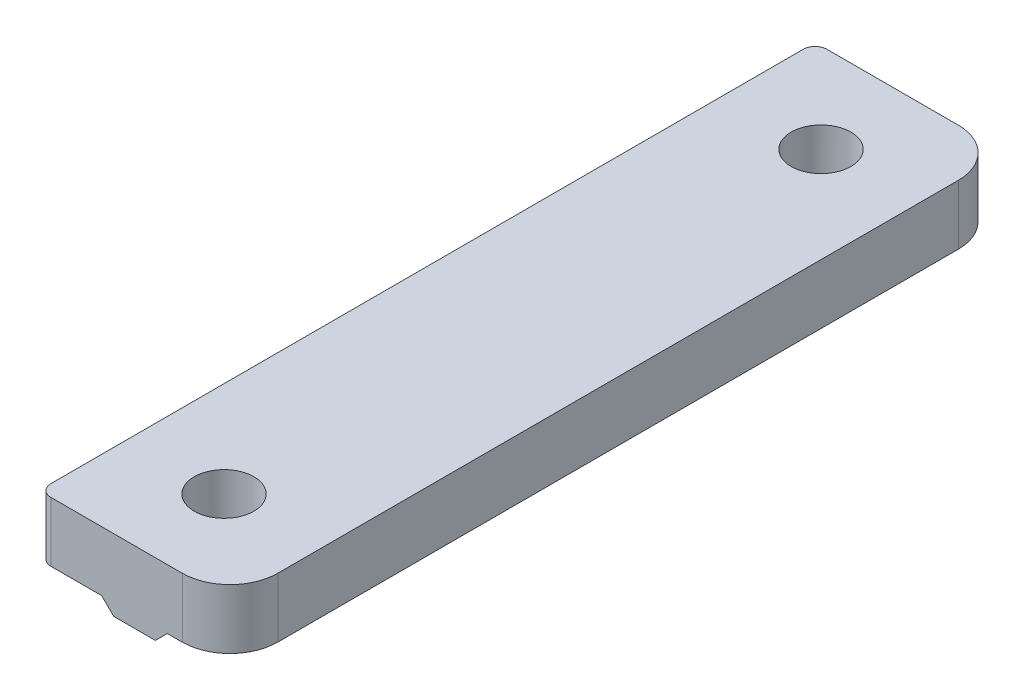
ISO-10303-21;
HEADER;
FILE_DESCRIPTION(('STEP AP214'),'2;1');
FILE_NAME('part.step','',(''),(''),'','','');
FILE_SCHEMA(('AUTOMOTIVE_DESIGN { 1 0 10303 214 1 1 1 1 }'));
ENDSEC;
DATA;
#1=APPLICATION_CONTEXT('core data for automotive mechanical design processes');
#2=APPLICATION_PROTOCOL_DEFINITION('international standard','automotive_design',2000,#1);
#3=PRODUCT_CONTEXT('',#1,'mechanical');
#4=PRODUCT('Part','Part','',(#3));
#5=PRODUCT_RELATED_PRODUCT_CATEGORY('part','',(#4));
#6=PRODUCT_DEFINITION_FORMATION('','',#4);
#7=PRODUCT_DEFINITION_CONTEXT('part definition',#1,'design');
#8=PRODUCT_DEFINITION('design','',#6,#7);
#9=PRODUCT_DEFINITION_SHAPE('','',#8);
#10=(LENGTH_UNIT() NAMED_UNIT(*) SI_UNIT(.MILLI.,.METRE.));
#11=(NAMED_UNIT(*) PLANE_ANGLE_UNIT() SI_UNIT($,.RADIAN.));
#12=(NAMED_UNIT(*) SI_UNIT($,.STERADIAN.) SOLID_ANGLE_UNIT());
#13=UNCERTAINTY_MEASURE_WITH_UNIT(LENGTH_MEASURE(1.E-05),#10,'distance_accuracy_value','');
#14=(GEOMETRIC_REPRESENTATION_CONTEXT(3) GLOBAL_UNCERTAINTY_ASSIGNED_CONTEXT((#13)) GLOBAL_UNIT_ASSIGNED_CONTEXT((#10,
#11,#12)) REPRESENTATION_CONTEXT('',''));
#15=CARTESIAN_POINT('',(0.,0.,0.));
#16=DIRECTION('',(0.,0.,1.));
#17=DIRECTION('',(1.,0.,0.));
#18=AXIS2_PLACEMENT_3D('',#15,#16,#17);
#19=CARTESIAN_POINT('',(-1.74999999999999,-3.5,-5.59016994374947));
#20=DIRECTION('',(0.,-1.,0.));
#21=DIRECTION('',(0.,0.,-1.));
#22=AXIS2_PLACEMENT_3D('',#19,#20,#21);
#23=PLANE('',#22);
#24=CARTESIAN_POINT('',(0.,-3.5,7.5));
#25=DIRECTION('',(0.,1.,0.));
#26=DIRECTION('',(0.,0.,1.));
#27=AXIS2_PLACEMENT_3D('',#24,#25,#26);
#28=CIRCLE('',#27,2.5);
#29=CARTESIAN_POINT('',(-1.74999999999999,-3.5,9.28535710713573));
#30=VERTEX_POINT('',#29);
#31=CARTESIAN_POINT('',(1.74999999999999,-3.5,9.28535710713573));
#32=VERTEX_POINT('',#31);
#33=EDGE_CURVE('E282',#30,#32,#28,.T.);
#34=ORIENTED_EDGE('',*,*,#33,.T.);
#35=DIRECTION('',(0.,0.,1.));
#36=VECTOR('',#35,1.);
#37=CARTESIAN_POINT('',(1.74999999999999,-3.5,-5.59016994374947));
#38=LINE('',#37,#36);
#39=CARTESIAN_POINT('',(1.74999999999999,-3.5,55.7146428928643));
#40=VERTEX_POINT('',#39);
#41=EDGE_CURVE('E169',#32,#40,#38,.T.);
#42=ORIENTED_EDGE('',*,*,#41,.T.);
#43=CARTESIAN_POINT('',(0.,-3.5,57.5));
#44=DIRECTION('',(0.,1.,0.));
#45=DIRECTION('',(0.,0.,-1.));
#46=AXIS2_PLACEMENT_3D('',#43,#44,#45);
#47=CIRCLE('',#46,2.5);
#48=CARTESIAN_POINT('',(-1.74999999999999,-3.5,55.7146428928643));
#49=VERTEX_POINT('',#48);
#50=EDGE_CURVE('E153',#40,#49,#47,.T.);
#51=ORIENTED_EDGE('',*,*,#50,.T.);
#52=DIRECTION('',(0.,0.,1.));
#53=VECTOR('',#52,1.);
#54=CARTESIAN_POINT('',(-1.74999999999999,-3.5,-5.59016994374947));
#55=LINE('',#54,#53);
#56=EDGE_CURVE('E167',#30,#49,#55,.T.);
#57=ORIENTED_EDGE('',*,*,#56,.F.);
#58=EDGE_LOOP('',(#34,#42,#51,#57));
#59=FACE_BOUND('',#58,.T.);
#60=ADVANCED_FACE('F33',(#59),#23,.T.);
#61=CARTESIAN_POINT('',(-1.74999999999999,-3.5,59.2853571071357));
#62=VERTEX_POINT('',#61);
#63=CARTESIAN_POINT('',(1.74999999999999,-3.5,59.2853571071357));
#64=VERTEX_POINT('',#63);
#65=EDGE_CURVE('E156',#62,#64,#47,.T.);
#66=ORIENTED_EDGE('',*,*,#65,.T.);
#67=CARTESIAN_POINT('',(1.74999999999999,-3.5,65.));
#68=VERTEX_POINT('',#67);
#69=EDGE_CURVE('E264',#64,#68,#38,.T.);
#70=ORIENTED_EDGE('',*,*,#69,.T.);
#71=DIRECTION('',(1.,0.,0.));
#72=VECTOR('',#71,1.);
#73=CARTESIAN_POINT('',(-1.74999999999999,-3.5,65.));
#74=LINE('',#73,#72);
#75=CARTESIAN_POINT('',(-1.74999999999999,-3.5,65.));
#76=VERTEX_POINT('',#75);
#77=EDGE_CURVE('E267',#76,#68,#74,.T.);
#78=ORIENTED_EDGE('',*,*,#77,.F.);
#79=EDGE_CURVE('E176',#62,#76,#55,.T.);
#80=ORIENTED_EDGE('',*,*,#79,.F.);
#81=EDGE_LOOP('',(#66,#70,#78,#80));
#82=FACE_BOUND('',#81,.T.);
#83=ADVANCED_FACE('F298',(#82),#23,.T.);
#84=CARTESIAN_POINT('',(-8.,-2.5,65.));
#85=DIRECTION('',(0.,1.,0.));
#86=DIRECTION('',(0.,0.,1.));
#87=AXIS2_PLACEMENT_3D('',#84,#85,#86);
#88=PLANE('',#87);
#89=DIRECTION('',(0.,0.,-1.));
#90=VECTOR('',#89,1.);
#91=CARTESIAN_POINT('',(8.,-2.5,65.));
#92=LINE('',#91,#90);
#93=CARTESIAN_POINT('',(8.,-2.5,61.));
#94=VERTEX_POINT('',#93);
#95=CARTESIAN_POINT('',(8.,-2.5,4.));
#96=VERTEX_POINT('',#95);
#97=EDGE_CURVE('E190',#94,#96,#92,.T.);
#98=ORIENTED_EDGE('',*,*,#97,.F.);
#99=CARTESIAN_POINT('',(4.,-2.5,61.));
#100=DIRECTION('',(0.,1.,0.));
#101=DIRECTION('',(0.,0.,1.));
#102=AXIS2_PLACEMENT_3D('',#99,#100,#101);
#103=CIRCLE('',#102,4.);
#104=CARTESIAN_POINT('',(4.,-2.5,65.));
#105=VERTEX_POINT('',#104);
#106=EDGE_CURVE('E219',#94,#105,#103,.F.);
#107=ORIENTED_EDGE('',*,*,#106,.T.);
#108=DIRECTION('',(1.,0.,0.));
#109=VECTOR('',#108,1.);
#110=CARTESIAN_POINT('',(-8.,-2.5,65.));
#111=LINE('',#110,#109);
#112=CARTESIAN_POINT('',(2.75,-2.5,65.));
#113=VERTEX_POINT('',#112);
#114=EDGE_CURVE('E186',#113,#105,#111,.T.);
#115=ORIENTED_EDGE('',*,*,#114,.F.);
#116=DIRECTION('',(0.,0.,1.));
#117=VECTOR('',#116,1.);
#118=CARTESIAN_POINT('',(2.75,-2.5,-5.59016994374947));
#119=LINE('',#118,#117);
#120=CARTESIAN_POINT('',(2.75,-2.5,0.));
#121=VERTEX_POINT('',#120);
#122=EDGE_CURVE('E258',#121,#113,#119,.T.);
#123=ORIENTED_EDGE('',*,*,#122,.F.);
#124=DIRECTION('',(1.,0.,0.));
#125=VECTOR('',#124,1.);
#126=CARTESIAN_POINT('',(-8.,-2.5,0.));
#127=LINE('',#126,#125);
#128=CARTESIAN_POINT('',(4.,-2.5,0.));
#129=VERTEX_POINT('',#128);
#130=EDGE_CURVE('E192',#121,#129,#127,.T.);
#131=ORIENTED_EDGE('',*,*,#130,.T.);
#132=CARTESIAN_POINT('',(4.,-2.5,4.));
#133=DIRECTION('',(0.,1.,0.));
#134=DIRECTION('',(0.,0.,1.));
#135=AXIS2_PLACEMENT_3D('',#132,#133,#134);
#136=CIRCLE('',#135,4.);
#137=EDGE_CURVE('E217',#129,#96,#136,.F.);
#138=ORIENTED_EDGE('',*,*,#137,.T.);
#139=EDGE_LOOP('',(#98,#107,#115,#123,#131,#138));
#140=FACE_BOUND('',#139,.T.);
#141=ADVANCED_FACE('F316',(#140),#88,.F.);
#142=CARTESIAN_POINT('',(8.,-2.5,65.));
#143=DIRECTION('',(-1.,0.,0.));
#144=DIRECTION('',(0.,0.,1.));
#145=AXIS2_PLACEMENT_3D('',#142,#143,#144);
#146=PLANE('',#145);
#147=DIRECTION('',(0.,0.,-1.));
#148=VECTOR('',#147,1.);
#149=CARTESIAN_POINT('',(8.,2.5,65.));
#150=LINE('',#149,#148);
#151=CARTESIAN_POINT('',(8.,2.5,61.));
#152=VERTEX_POINT('',#151);
#153=CARTESIAN_POINT('',(8.,2.5,4.));
#154=VERTEX_POINT('',#153);
#155=EDGE_CURVE('E161',#152,#154,#150,.T.);
#156=ORIENTED_EDGE('',*,*,#155,.F.);
#157=DIRECTION('',(0.,1.,0.));
#158=VECTOR('',#157,1.);
#159=CARTESIAN_POINT('',(8.,-2.5,61.));
#160=LINE('',#159,#158);
#161=EDGE_CURVE('E215',#152,#94,#160,.F.);
#162=ORIENTED_EDGE('',*,*,#161,.T.);
#163=ORIENTED_EDGE('',*,*,#97,.T.);
#164=DIRECTION('',(0.,1.,0.));
#165=VECTOR('',#164,1.);
#166=CARTESIAN_POINT('',(8.,2.5,4.));
#167=LINE('',#166,#165);
#168=EDGE_CURVE('E212',#96,#154,#167,.T.);
#169=ORIENTED_EDGE('',*,*,#168,.T.);
#170=EDGE_LOOP('',(#156,#162,#163,#169));
#171=FACE_BOUND('',#170,.T.);
#172=ADVANCED_FACE('F335',(#171),#146,.F.);
#173=CARTESIAN_POINT('',(-8.,2.5,65.));
#174=DIRECTION('',(0.,-1.,0.));
#175=DIRECTION('',(0.,0.,-1.));
#176=AXIS2_PLACEMENT_3D('',#173,#174,#175);
#177=PLANE('',#176);
#178=CARTESIAN_POINT('',(0.,2.5,7.5));
#179=DIRECTION('',(0.,1.,0.));
#180=DIRECTION('',(0.,0.,1.));
#181=AXIS2_PLACEMENT_3D('',#178,#179,#180);
#182=CIRCLE('',#181,2.5);
#183=CARTESIAN_POINT('',(0.,2.5,10.));
#184=VERTEX_POINT('',#183);
#185=EDGE_CURVE('E279',#184,#184,#182,.T.);
#186=ORIENTED_EDGE('',*,*,#185,.F.);
#187=EDGE_LOOP('',(#186));
#188=FACE_BOUND('',#187,.T.);
#189=CARTESIAN_POINT('',(0.,2.5,57.5));
#190=DIRECTION('',(0.,1.,0.));
#191=DIRECTION('',(0.,0.,-1.));
#192=AXIS2_PLACEMENT_3D('',#189,#190,#191);
#193=CIRCLE('',#192,2.5);
#194=CARTESIAN_POINT('',(0.,2.5,55.));
#195=VERTEX_POINT('',#194);
#196=EDGE_CURVE('E170',#195,#195,#193,.T.);
#197=ORIENTED_EDGE('',*,*,#196,.F.);
#198=EDGE_LOOP('',(#197));
#199=FACE_BOUND('',#198,.T.);
#200=DIRECTION('',(-1.,0.,0.));
#201=VECTOR('',#200,1.);
#202=CARTESIAN_POINT('',(-8.,2.5,0.));
#203=LINE('',#202,#201);
#204=CARTESIAN_POINT('',(4.,2.5,0.));
#205=VERTEX_POINT('',#204);
#206=CARTESIAN_POINT('',(-7.,2.5,0.));
#207=VERTEX_POINT('',#206);
#208=EDGE_CURVE('E178',#205,#207,#203,.T.);
#209=ORIENTED_EDGE('',*,*,#208,.T.);
#210=CARTESIAN_POINT('',(-7.,2.5,1.));
#211=DIRECTION('',(0.,-1.,0.));
#212=DIRECTION('',(0.,0.,-1.));
#213=AXIS2_PLACEMENT_3D('',#210,#211,#212);
#214=CIRCLE('',#213,1.);
#215=CARTESIAN_POINT('',(-8.,2.5,1.));
#216=VERTEX_POINT('',#215);
#217=EDGE_CURVE('E41',#207,#216,#214,.F.);
#218=ORIENTED_EDGE('',*,*,#217,.T.);
#219=DIRECTION('',(0.,0.,-1.));
#220=VECTOR('',#219,1.);
#221=CARTESIAN_POINT('',(-8.,2.5,65.));
#222=LINE('',#221,#220);
#223=CARTESIAN_POINT('',(-8.,2.5,64.));
#224=VERTEX_POINT('',#223);
#225=EDGE_CURVE('E199',#224,#216,#222,.T.);
#226=ORIENTED_EDGE('',*,*,#225,.F.);
#227=CARTESIAN_POINT('',(-7.,2.5,64.));
#228=DIRECTION('',(0.,-1.,0.));
#229=DIRECTION('',(0.,0.,-1.));
#230=AXIS2_PLACEMENT_3D('',#227,#228,#229);
#231=CIRCLE('',#230,1.);
#232=CARTESIAN_POINT('',(-7.,2.5,65.));
#233=VERTEX_POINT('',#232);
#234=EDGE_CURVE('E48',#224,#233,#231,.F.);
#235=ORIENTED_EDGE('',*,*,#234,.T.);
#236=DIRECTION('',(-1.,0.,0.));
#237=VECTOR('',#236,1.);
#238=CARTESIAN_POINT('',(-8.,2.5,65.));
#239=LINE('',#238,#237);
#240=CARTESIAN_POINT('',(4.,2.5,65.));
#241=VERTEX_POINT('',#240);
#242=EDGE_CURVE('E184',#241,#233,#239,.T.);
#243=ORIENTED_EDGE('',*,*,#242,.F.);
#244=CARTESIAN_POINT('',(4.,2.5,61.));
#245=DIRECTION('',(0.,-1.,0.));
#246=DIRECTION('',(0.,0.,-1.));
#247=AXIS2_PLACEMENT_3D('',#244,#245,#246);
#248=CIRCLE('',#247,4.);
#249=EDGE_CURVE('E210',#241,#152,#248,.F.);
#250=ORIENTED_EDGE('',*,*,#249,.T.);
#251=ORIENTED_EDGE('',*,*,#155,.T.);
#252=CARTESIAN_POINT('',(4.,2.5,4.));
#253=DIRECTION('',(0.,-1.,0.));
#254=DIRECTION('',(0.,0.,-1.));
#255=AXIS2_PLACEMENT_3D('',#252,#253,#254);
#256=CIRCLE('',#255,4.);
#257=EDGE_CURVE('E208',#154,#205,#256,.F.);
#258=ORIENTED_EDGE('',*,*,#257,.T.);
#259=EDGE_LOOP('',(#209,#218,#226,#235,#243,#250,#251,#258));
#260=FACE_BOUND('',#259,.T.);
#261=ADVANCED_FACE('F234',(#188,#199,#260),#177,.F.);
#262=CARTESIAN_POINT('',(-8.,-2.5,65.));
#263=DIRECTION('',(1.,0.,0.));
#264=DIRECTION('',(0.,0.,-1.));
#265=AXIS2_PLACEMENT_3D('',#262,#263,#264);
#266=PLANE('',#265);
#267=ORIENTED_EDGE('',*,*,#225,.T.);
#268=DIRECTION('',(0.,-1.,0.));
#269=VECTOR('',#268,1.);
#270=CARTESIAN_POINT('',(-8.,-2.5,1.));
#271=LINE('',#270,#269);
#272=CARTESIAN_POINT('',(-8.,-2.5,1.));
#273=VERTEX_POINT('',#272);
#274=EDGE_CURVE('E225',#216,#273,#271,.T.);
#275=ORIENTED_EDGE('',*,*,#274,.T.);
#276=DIRECTION('',(0.,0.,-1.));
#277=VECTOR('',#276,1.);
#278=CARTESIAN_POINT('',(-8.,-2.5,65.));
#279=LINE('',#278,#277);
#280=CARTESIAN_POINT('',(-8.,-2.5,64.));
#281=VERTEX_POINT('',#280);
#282=EDGE_CURVE('E196',#281,#273,#279,.T.);
#283=ORIENTED_EDGE('',*,*,#282,.F.);
#284=DIRECTION('',(0.,-1.,0.));
#285=VECTOR('',#284,1.);
#286=CARTESIAN_POINT('',(-8.,-2.5,64.));
#287=LINE('',#286,#285);
#288=EDGE_CURVE('E223',#281,#224,#287,.F.);
#289=ORIENTED_EDGE('',*,*,#288,.T.);
#290=EDGE_LOOP('',(#267,#275,#283,#289));
#291=FACE_BOUND('',#290,.T.);
#292=ADVANCED_FACE('F238',(#291),#266,.F.);
#293=ORIENTED_EDGE('',*,*,#282,.T.);
#294=CARTESIAN_POINT('',(-7.,-2.5,1.));
#295=DIRECTION('',(0.,1.,0.));
#296=DIRECTION('',(0.,0.,1.));
#297=AXIS2_PLACEMENT_3D('',#294,#295,#296);
#298=CIRCLE('',#297,1.);
#299=CARTESIAN_POINT('',(-7.,-2.5,0.));
#300=VERTEX_POINT('',#299);
#301=EDGE_CURVE('E230',#273,#300,#298,.F.);
#302=ORIENTED_EDGE('',*,*,#301,.T.);
#303=CARTESIAN_POINT('',(-2.75,-2.5,0.));
#304=VERTEX_POINT('',#303);
#305=EDGE_CURVE('E187',#300,#304,#127,.T.);
#306=ORIENTED_EDGE('',*,*,#305,.T.);
#307=DIRECTION('',(0.,0.,1.));
#308=VECTOR('',#307,1.);
#309=CARTESIAN_POINT('',(-2.75,-2.5,-5.59016994374947));
#310=LINE('',#309,#308);
#311=CARTESIAN_POINT('',(-2.75,-2.5,65.));
#312=VERTEX_POINT('',#311);
#313=EDGE_CURVE('E252',#304,#312,#310,.T.);
#314=ORIENTED_EDGE('',*,*,#313,.T.);
#315=CARTESIAN_POINT('',(-7.,-2.5,65.));
#316=VERTEX_POINT('',#315);
#317=EDGE_CURVE('E188',#316,#312,#111,.T.);
#318=ORIENTED_EDGE('',*,*,#317,.F.);
#319=CARTESIAN_POINT('',(-7.,-2.5,64.));
#320=DIRECTION('',(0.,1.,0.));
#321=DIRECTION('',(0.,0.,1.));
#322=AXIS2_PLACEMENT_3D('',#319,#320,#321);
#323=CIRCLE('',#322,1.);
#324=EDGE_CURVE('E228',#316,#281,#323,.F.);
#325=ORIENTED_EDGE('',*,*,#324,.T.);
#326=EDGE_LOOP('',(#293,#302,#306,#314,#318,#325));
#327=FACE_BOUND('',#326,.T.);
#328=ADVANCED_FACE('F243',(#327),#88,.F.);
#329=CARTESIAN_POINT('',(0.,0.,65.));
#330=DIRECTION('',(0.,0.,-1.));
#331=DIRECTION('',(-1.,0.,0.));
#332=AXIS2_PLACEMENT_3D('',#329,#330,#331);
#333=PLANE('',#332);
#334=ORIENTED_EDGE('',*,*,#242,.T.);
#335=DIRECTION('',(0.,-1.,0.));
#336=VECTOR('',#335,1.);
#337=CARTESIAN_POINT('',(-7.,0.,65.));
#338=LINE('',#337,#336);
#339=EDGE_CURVE('E11',#233,#316,#338,.T.);
#340=ORIENTED_EDGE('',*,*,#339,.T.);
#341=ORIENTED_EDGE('',*,*,#317,.T.);
#342=DIRECTION('',(0.707106781186552,-0.707106781186544,0.));
#343=VECTOR('',#342,1.);
#344=CARTESIAN_POINT('',(-1.74999999999999,-3.5,65.));
#345=LINE('',#344,#343);
#346=EDGE_CURVE('E256',#312,#76,#345,.T.);
#347=ORIENTED_EDGE('',*,*,#346,.T.);
#348=ORIENTED_EDGE('',*,*,#77,.T.);
#349=DIRECTION('',(0.707106781186552,0.707106781186544,0.));
#350=VECTOR('',#349,1.);
#351=CARTESIAN_POINT('',(1.74999999999999,-3.5,65.));
#352=LINE('',#351,#350);
#353=EDGE_CURVE('E265',#68,#113,#352,.T.);
#354=ORIENTED_EDGE('',*,*,#353,.T.);
#355=ORIENTED_EDGE('',*,*,#114,.T.);
#356=DIRECTION('',(0.,1.,0.));
#357=VECTOR('',#356,1.);
#358=CARTESIAN_POINT('',(4.,0.,65.));
#359=LINE('',#358,#357);
#360=EDGE_CURVE('E205',#105,#241,#359,.T.);
#361=ORIENTED_EDGE('',*,*,#360,.T.);
#362=EDGE_LOOP('',(#334,#340,#341,#347,#348,#354,#355,#361));
#363=FACE_BOUND('',#362,.T.);
#364=ADVANCED_FACE('F303',(#363),#333,.F.);
#365=CARTESIAN_POINT('',(0.,0.,0.));
#366=DIRECTION('',(0.,0.,-1.));
#367=DIRECTION('',(-1.,0.,0.));
#368=AXIS2_PLACEMENT_3D('',#365,#366,#367);
#369=PLANE('',#368);
#370=ORIENTED_EDGE('',*,*,#305,.F.);
#371=DIRECTION('',(0.,-1.,0.));
#372=VECTOR('',#371,1.);
#373=CARTESIAN_POINT('',(-7.,2.5,0.));
#374=LINE('',#373,#372);
#375=EDGE_CURVE('E56',#300,#207,#374,.F.);
#376=ORIENTED_EDGE('',*,*,#375,.T.);
#377=ORIENTED_EDGE('',*,*,#208,.F.);
#378=DIRECTION('',(0.,1.,0.));
#379=VECTOR('',#378,1.);
#380=CARTESIAN_POINT('',(4.,-2.5,0.));
#381=LINE('',#380,#379);
#382=EDGE_CURVE('E221',#205,#129,#381,.F.);
#383=ORIENTED_EDGE('',*,*,#382,.T.);
#384=ORIENTED_EDGE('',*,*,#130,.F.);
#385=DIRECTION('',(0.707106781186552,0.707106781186544,0.));
#386=VECTOR('',#385,1.);
#387=CARTESIAN_POINT('',(1.74999999999999,-3.5,0.));
#388=LINE('',#387,#386);
#389=CARTESIAN_POINT('',(1.74999999999999,-3.5,0.));
#390=VERTEX_POINT('',#389);
#391=EDGE_CURVE('E260',#390,#121,#388,.T.);
#392=ORIENTED_EDGE('',*,*,#391,.F.);
#393=DIRECTION('',(1.,0.,0.));
#394=VECTOR('',#393,1.);
#395=CARTESIAN_POINT('',(-1.74999999999999,-3.5,0.));
#396=LINE('',#395,#394);
#397=CARTESIAN_POINT('',(-1.74999999999999,-3.5,0.));
#398=VERTEX_POINT('',#397);
#399=EDGE_CURVE('E250',#398,#390,#396,.T.);
#400=ORIENTED_EDGE('',*,*,#399,.F.);
#401=DIRECTION('',(0.707106781186552,-0.707106781186544,0.));
#402=VECTOR('',#401,1.);
#403=CARTESIAN_POINT('',(-1.74999999999999,-3.5,0.));
#404=LINE('',#403,#402);
#405=EDGE_CURVE('E179',#304,#398,#404,.T.);
#406=ORIENTED_EDGE('',*,*,#405,.F.);
#407=EDGE_LOOP('',(#370,#376,#377,#383,#384,#392,#400,#406));
#408=FACE_BOUND('',#407,.T.);
#409=ADVANCED_FACE('F246',(#408),#369,.T.);
#410=CARTESIAN_POINT('',(1.74999999999999,-3.5,5.71464289286427));
#411=VERTEX_POINT('',#410);
#412=CARTESIAN_POINT('',(-1.74999999999999,-3.5,5.71464289286427));
#413=VERTEX_POINT('',#412);
#414=EDGE_CURVE('E276',#411,#413,#28,.T.);
#415=ORIENTED_EDGE('',*,*,#414,.T.);
#416=EDGE_CURVE('E175',#398,#413,#55,.T.);
#417=ORIENTED_EDGE('',*,*,#416,.F.);
#418=ORIENTED_EDGE('',*,*,#399,.T.);
#419=EDGE_CURVE('E182',#390,#411,#38,.T.);
#420=ORIENTED_EDGE('',*,*,#419,.T.);
#421=EDGE_LOOP('',(#415,#417,#418,#420));
#422=FACE_BOUND('',#421,.T.);
#423=ADVANCED_FACE('F286',(#422),#23,.T.);
#424=CARTESIAN_POINT('',(1.74999999999999,-3.5,-5.59016994374947));
#425=DIRECTION('',(0.707106781186544,-0.707106781186552,0.));
#426=DIRECTION('',(0.707106781186552,0.707106781186544,0.));
#427=AXIS2_PLACEMENT_3D('',#424,#425,#426);
#428=PLANE('',#427);
#429=CARTESIAN_POINT('',(0.,-5.24999999999997,7.5));
#430=DIRECTION('',(0.707106781186544,-0.707106781186552,0.));
#431=DIRECTION('',(0.707106781186552,0.707106781186544,0.));
#432=AXIS2_PLACEMENT_3D('',#429,#430,#431);
#433=ELLIPSE('',#432,3.53553390593272,2.5);
#434=EDGE_CURVE('E268',#411,#32,#433,.T.);
#435=ORIENTED_EDGE('',*,*,#434,.F.);
#436=ORIENTED_EDGE('',*,*,#419,.F.);
#437=ORIENTED_EDGE('',*,*,#391,.T.);
#438=ORIENTED_EDGE('',*,*,#122,.T.);
#439=ORIENTED_EDGE('',*,*,#353,.F.);
#440=ORIENTED_EDGE('',*,*,#69,.F.);
#441=CARTESIAN_POINT('',(0.,-5.24999999999997,57.5));
#442=DIRECTION('',(0.707106781186544,-0.707106781186552,0.));
#443=DIRECTION('',(0.707106781186552,0.707106781186544,0.));
#444=AXIS2_PLACEMENT_3D('',#441,#442,#443);
#445=ELLIPSE('',#444,3.53553390593272,2.5);
#446=EDGE_CURVE('E274',#40,#64,#445,.T.);
#447=ORIENTED_EDGE('',*,*,#446,.F.);
#448=ORIENTED_EDGE('',*,*,#41,.F.);
#449=EDGE_LOOP('',(#435,#436,#437,#438,#439,#440,#447,#448));
#450=FACE_BOUND('',#449,.T.);
#451=ADVANCED_FACE('F293',(#450),#428,.T.);
#452=CARTESIAN_POINT('',(-1.74999999999999,-3.5,-5.59016994374947));
#453=DIRECTION('',(-0.707106781186544,-0.707106781186552,0.));
#454=DIRECTION('',(0.707106781186552,-0.707106781186544,0.));
#455=AXIS2_PLACEMENT_3D('',#452,#453,#454);
#456=PLANE('',#455);
#457=CARTESIAN_POINT('',(0.,-5.24999999999997,7.5));
#458=DIRECTION('',(-0.707106781186544,-0.707106781186552,0.));
#459=DIRECTION('',(-0.707106781186552,0.707106781186544,0.));
#460=AXIS2_PLACEMENT_3D('',#457,#458,#459);
#461=ELLIPSE('',#460,3.53553390593272,2.5);
#462=EDGE_CURVE('E160',#30,#413,#461,.T.);
#463=ORIENTED_EDGE('',*,*,#462,.F.);
#464=ORIENTED_EDGE('',*,*,#56,.T.);
#465=CARTESIAN_POINT('',(0.,-5.24999999999997,57.5));
#466=DIRECTION('',(-0.707106781186544,-0.707106781186552,0.));
#467=DIRECTION('',(-0.707106781186552,0.707106781186544,0.));
#468=AXIS2_PLACEMENT_3D('',#465,#466,#467);
#469=ELLIPSE('',#468,3.53553390593272,2.5);
#470=EDGE_CURVE('E149',#62,#49,#469,.T.);
#471=ORIENTED_EDGE('',*,*,#470,.F.);
#472=ORIENTED_EDGE('',*,*,#79,.T.);
#473=ORIENTED_EDGE('',*,*,#346,.F.);
#474=ORIENTED_EDGE('',*,*,#313,.F.);
#475=ORIENTED_EDGE('',*,*,#405,.T.);
#476=ORIENTED_EDGE('',*,*,#416,.T.);
#477=EDGE_LOOP('',(#463,#464,#471,#472,#473,#474,#475,#476));
#478=FACE_BOUND('',#477,.T.);
#479=ADVANCED_FACE('F173',(#478),#456,.T.);
#480=CARTESIAN_POINT('',(0.,-3.5,57.5));
#481=DIRECTION('',(0.,1.,0.));
#482=DIRECTION('',(0.,0.,1.));
#483=AXIS2_PLACEMENT_3D('',#480,#481,#482);
#484=CYLINDRICAL_SURFACE('',#483,2.5);
#485=ORIENTED_EDGE('',*,*,#446,.T.);
#486=ORIENTED_EDGE('',*,*,#65,.F.);
#487=ORIENTED_EDGE('',*,*,#470,.T.);
#488=ORIENTED_EDGE('',*,*,#50,.F.);
#489=EDGE_LOOP('',(#485,#486,#487,#488));
#490=FACE_BOUND('',#489,.T.);
#491=ORIENTED_EDGE('',*,*,#196,.T.);
#492=EDGE_LOOP('',(#491));
#493=FACE_BOUND('',#492,.T.);
#494=ADVANCED_FACE('F151',(#490,#493),#484,.F.);
#495=CARTESIAN_POINT('',(0.,-3.5,7.5));
#496=DIRECTION('',(0.,1.,0.));
#497=DIRECTION('',(0.,0.,1.));
#498=AXIS2_PLACEMENT_3D('',#495,#496,#497);
#499=CYLINDRICAL_SURFACE('',#498,2.5);
#500=ORIENTED_EDGE('',*,*,#434,.T.);
#501=ORIENTED_EDGE('',*,*,#33,.F.);
#502=ORIENTED_EDGE('',*,*,#462,.T.);
#503=ORIENTED_EDGE('',*,*,#414,.F.);
#504=EDGE_LOOP('',(#500,#501,#502,#503));
#505=FACE_BOUND('',#504,.T.);
#506=ORIENTED_EDGE('',*,*,#185,.T.);
#507=EDGE_LOOP('',(#506));
#508=FACE_BOUND('',#507,.T.);
#509=ADVANCED_FACE('F290',(#505,#508),#499,.F.);
#510=CARTESIAN_POINT('',(4.,0.,61.));
#511=DIRECTION('',(0.,1.,0.));
#512=DIRECTION('',(0.,0.,1.));
#513=AXIS2_PLACEMENT_3D('',#510,#511,#512);
#514=CYLINDRICAL_SURFACE('',#513,4.);
#515=ORIENTED_EDGE('',*,*,#106,.F.);
#516=ORIENTED_EDGE('',*,*,#161,.F.);
#517=ORIENTED_EDGE('',*,*,#249,.F.);
#518=ORIENTED_EDGE('',*,*,#360,.F.);
#519=EDGE_LOOP('',(#515,#516,#517,#518));
#520=FACE_BOUND('',#519,.T.);
#521=ADVANCED_FACE('F340',(#520),#514,.T.);
#522=CARTESIAN_POINT('',(4.,-2.5,4.));
#523=DIRECTION('',(0.,-1.,0.));
#524=DIRECTION('',(0.,0.,-1.));
#525=AXIS2_PLACEMENT_3D('',#522,#523,#524);
#526=CYLINDRICAL_SURFACE('',#525,4.);
#527=ORIENTED_EDGE('',*,*,#137,.F.);
#528=ORIENTED_EDGE('',*,*,#382,.F.);
#529=ORIENTED_EDGE('',*,*,#257,.F.);
#530=ORIENTED_EDGE('',*,*,#168,.F.);
#531=EDGE_LOOP('',(#527,#528,#529,#530));
#532=FACE_BOUND('',#531,.T.);
#533=ADVANCED_FACE('F310',(#532),#526,.T.);
#534=CARTESIAN_POINT('',(-7.,-2.5,1.));
#535=DIRECTION('',(0.,1.,0.));
#536=DIRECTION('',(0.,0.,1.));
#537=AXIS2_PLACEMENT_3D('',#534,#535,#536);
#538=CYLINDRICAL_SURFACE('',#537,1.);
#539=ORIENTED_EDGE('',*,*,#217,.F.);
#540=ORIENTED_EDGE('',*,*,#375,.F.);
#541=ORIENTED_EDGE('',*,*,#301,.F.);
#542=ORIENTED_EDGE('',*,*,#274,.F.);
#543=EDGE_LOOP('',(#539,#540,#541,#542));
#544=FACE_BOUND('',#543,.T.);
#545=ADVANCED_FACE('F241',(#544),#538,.T.);
#546=CARTESIAN_POINT('',(-7.,0.,64.));
#547=DIRECTION('',(0.,-1.,0.));
#548=DIRECTION('',(0.,0.,-1.));
#549=AXIS2_PLACEMENT_3D('',#546,#547,#548);
#550=CYLINDRICAL_SURFACE('',#549,1.);
#551=ORIENTED_EDGE('',*,*,#234,.F.);
#552=ORIENTED_EDGE('',*,*,#288,.F.);
#553=ORIENTED_EDGE('',*,*,#324,.F.);
#554=ORIENTED_EDGE('',*,*,#339,.F.);
#555=EDGE_LOOP('',(#551,#552,#553,#554));
#556=FACE_BOUND('',#555,.T.);
#557=ADVANCED_FACE('F35',(#556),#550,.T.);
#558=CLOSED_SHELL('',(#60,#83,#141,#172,#261,#292,#328,#364,#409,#423,#451,#479,#494,#509,#521,
#533,#545,#557));
#559=MANIFOLD_SOLID_BREP('B2',#558);
#560=ADVANCED_BREP_SHAPE_REPRESENTATION('',(#18,#559),#14);
#561=SHAPE_DEFINITION_REPRESENTATION(#9,#560);
ENDSEC;
END-ISO-10303-21;
